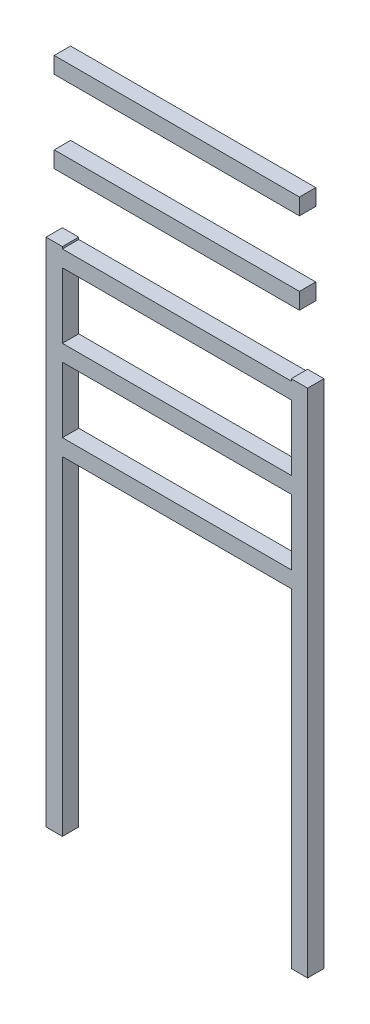
ISO-10303-21;
HEADER;
FILE_DESCRIPTION(('STEP AP214'),'2;1');
FILE_NAME('part.step','',(''),(''),'','','');
FILE_SCHEMA(('AUTOMOTIVE_DESIGN { 1 0 10303 214 1 1 1 1 }'));
ENDSEC;
DATA;
#1=APPLICATION_CONTEXT('core data for automotive mechanical design processes');
#2=APPLICATION_PROTOCOL_DEFINITION('international standard','automotive_design',2000,#1);
#3=PRODUCT_CONTEXT('',#1,'mechanical');
#4=PRODUCT('Part','Part','',(#3));
#5=PRODUCT_RELATED_PRODUCT_CATEGORY('part','',(#4));
#6=PRODUCT_DEFINITION_FORMATION('','',#4);
#7=PRODUCT_DEFINITION_CONTEXT('part definition',#1,'design');
#8=PRODUCT_DEFINITION('design','',#6,#7);
#9=PRODUCT_DEFINITION_SHAPE('','',#8);
#10=(LENGTH_UNIT() NAMED_UNIT(*) SI_UNIT(.MILLI.,.METRE.));
#11=(NAMED_UNIT(*) PLANE_ANGLE_UNIT() SI_UNIT($,.RADIAN.));
#12=(NAMED_UNIT(*) SI_UNIT($,.STERADIAN.) SOLID_ANGLE_UNIT());
#13=UNCERTAINTY_MEASURE_WITH_UNIT(LENGTH_MEASURE(1.E-05),#10,'distance_accuracy_value','');
#14=(GEOMETRIC_REPRESENTATION_CONTEXT(3) GLOBAL_UNCERTAINTY_ASSIGNED_CONTEXT((#13)) GLOBAL_UNIT_ASSIGNED_CONTEXT((#10,
#11,#12)) REPRESENTATION_CONTEXT('',''));
#15=CARTESIAN_POINT('',(0.,0.,0.));
#16=DIRECTION('',(0.,0.,1.));
#17=DIRECTION('',(1.,0.,0.));
#18=AXIS2_PLACEMENT_3D('',#15,#16,#17);
#19=CARTESIAN_POINT('',(600.,1960.,80.));
#20=DIRECTION('',(-1.,0.,0.));
#21=DIRECTION('',(0.,0.,1.));
#22=AXIS2_PLACEMENT_3D('',#19,#20,#21);
#23=PLANE('',#22);
#24=DIRECTION('',(0.,1.,0.));
#25=VECTOR('',#24,1.);
#26=CARTESIAN_POINT('',(600.,1960.,0.));
#27=LINE('',#26,#25);
#28=CARTESIAN_POINT('',(600.,1960.,0.));
#29=VERTEX_POINT('',#28);
#30=CARTESIAN_POINT('',(600.,2040.,0.));
#31=VERTEX_POINT('',#30);
#32=EDGE_CURVE('E115',#29,#31,#27,.T.);
#33=ORIENTED_EDGE('',*,*,#32,.T.);
#34=DIRECTION('',(0.,0.,-1.));
#35=VECTOR('',#34,1.);
#36=CARTESIAN_POINT('',(600.,2040.,80.));
#37=LINE('',#36,#35);
#38=CARTESIAN_POINT('',(600.,2040.,80.));
#39=VERTEX_POINT('',#38);
#40=EDGE_CURVE('E12',#39,#31,#37,.T.);
#41=ORIENTED_EDGE('',*,*,#40,.F.);
#42=DIRECTION('',(0.,1.,0.));
#43=VECTOR('',#42,1.);
#44=CARTESIAN_POINT('',(600.,1960.,80.));
#45=LINE('',#44,#43);
#46=CARTESIAN_POINT('',(600.,1960.,80.));
#47=VERTEX_POINT('',#46);
#48=EDGE_CURVE('E103',#47,#39,#45,.T.);
#49=ORIENTED_EDGE('',*,*,#48,.F.);
#50=DIRECTION('',(0.,0.,-1.));
#51=VECTOR('',#50,1.);
#52=CARTESIAN_POINT('',(600.,1960.,80.));
#53=LINE('',#52,#51);
#54=EDGE_CURVE('E111',#47,#29,#53,.T.);
#55=ORIENTED_EDGE('',*,*,#54,.T.);
#56=EDGE_LOOP('',(#33,#41,#49,#55));
#57=FACE_BOUND('',#56,.T.);
#58=ADVANCED_FACE('F52',(#57),#23,.F.);
#59=CARTESIAN_POINT('',(-600.,2040.,80.));
#60=DIRECTION('',(0.,-1.,0.));
#61=DIRECTION('',(0.,0.,-1.));
#62=AXIS2_PLACEMENT_3D('',#59,#60,#61);
#63=PLANE('',#62);
#64=DIRECTION('',(-1.,0.,0.));
#65=VECTOR('',#64,1.);
#66=CARTESIAN_POINT('',(-600.,2040.,0.));
#67=LINE('',#66,#65);
#68=CARTESIAN_POINT('',(-600.,2040.,0.));
#69=VERTEX_POINT('',#68);
#70=EDGE_CURVE('E107',#31,#69,#67,.T.);
#71=ORIENTED_EDGE('',*,*,#70,.T.);
#72=DIRECTION('',(0.,0.,-1.));
#73=VECTOR('',#72,1.);
#74=CARTESIAN_POINT('',(-600.,2040.,80.));
#75=LINE('',#74,#73);
#76=CARTESIAN_POINT('',(-600.,2040.,80.));
#77=VERTEX_POINT('',#76);
#78=EDGE_CURVE('E60',#77,#69,#75,.T.);
#79=ORIENTED_EDGE('',*,*,#78,.F.);
#80=DIRECTION('',(-1.,0.,0.));
#81=VECTOR('',#80,1.);
#82=CARTESIAN_POINT('',(-600.,2040.,80.));
#83=LINE('',#82,#81);
#84=EDGE_CURVE('E98',#39,#77,#83,.T.);
#85=ORIENTED_EDGE('',*,*,#84,.F.);
#86=ORIENTED_EDGE('',*,*,#40,.T.);
#87=EDGE_LOOP('',(#71,#79,#85,#86));
#88=FACE_BOUND('',#87,.T.);
#89=ADVANCED_FACE('F106',(#88),#63,.F.);
#90=CARTESIAN_POINT('',(-600.,1960.,80.));
#91=DIRECTION('',(1.,0.,0.));
#92=DIRECTION('',(0.,0.,-1.));
#93=AXIS2_PLACEMENT_3D('',#90,#91,#92);
#94=PLANE('',#93);
#95=DIRECTION('',(0.,-1.,0.));
#96=VECTOR('',#95,1.);
#97=CARTESIAN_POINT('',(-600.,1960.,0.));
#98=LINE('',#97,#96);
#99=CARTESIAN_POINT('',(-600.,1960.,0.));
#100=VERTEX_POINT('',#99);
#101=EDGE_CURVE('E85',#69,#100,#98,.T.);
#102=ORIENTED_EDGE('',*,*,#101,.T.);
#103=DIRECTION('',(0.,0.,-1.));
#104=VECTOR('',#103,1.);
#105=CARTESIAN_POINT('',(-600.,1960.,80.));
#106=LINE('',#105,#104);
#107=CARTESIAN_POINT('',(-600.,1960.,80.));
#108=VERTEX_POINT('',#107);
#109=EDGE_CURVE('E108',#108,#100,#106,.T.);
#110=ORIENTED_EDGE('',*,*,#109,.F.);
#111=DIRECTION('',(0.,-1.,0.));
#112=VECTOR('',#111,1.);
#113=CARTESIAN_POINT('',(-600.,1960.,80.));
#114=LINE('',#113,#112);
#115=EDGE_CURVE('E101',#77,#108,#114,.T.);
#116=ORIENTED_EDGE('',*,*,#115,.F.);
#117=ORIENTED_EDGE('',*,*,#78,.T.);
#118=EDGE_LOOP('',(#102,#110,#116,#117));
#119=FACE_BOUND('',#118,.T.);
#120=ADVANCED_FACE('F109',(#119),#94,.F.);
#121=CARTESIAN_POINT('',(-600.,1960.,80.));
#122=DIRECTION('',(0.,1.,0.));
#123=DIRECTION('',(0.,0.,1.));
#124=AXIS2_PLACEMENT_3D('',#121,#122,#123);
#125=PLANE('',#124);
#126=DIRECTION('',(1.,0.,0.));
#127=VECTOR('',#126,1.);
#128=CARTESIAN_POINT('',(-600.,1960.,0.));
#129=LINE('',#128,#127);
#130=EDGE_CURVE('E91',#100,#29,#129,.T.);
#131=ORIENTED_EDGE('',*,*,#130,.T.);
#132=ORIENTED_EDGE('',*,*,#54,.F.);
#133=DIRECTION('',(1.,0.,0.));
#134=VECTOR('',#133,1.);
#135=CARTESIAN_POINT('',(-600.,1960.,80.));
#136=LINE('',#135,#134);
#137=EDGE_CURVE('E68',#108,#47,#136,.T.);
#138=ORIENTED_EDGE('',*,*,#137,.F.);
#139=ORIENTED_EDGE('',*,*,#109,.T.);
#140=EDGE_LOOP('',(#131,#132,#138,#139));
#141=FACE_BOUND('',#140,.T.);
#142=ADVANCED_FACE('F122',(#141),#125,.F.);
#143=CARTESIAN_POINT('',(0.,0.,80.));
#144=DIRECTION('',(0.,0.,-1.));
#145=DIRECTION('',(-1.,0.,0.));
#146=AXIS2_PLACEMENT_3D('',#143,#144,#145);
#147=PLANE('',#146);
#148=ORIENTED_EDGE('',*,*,#48,.T.);
#149=ORIENTED_EDGE('',*,*,#84,.T.);
#150=ORIENTED_EDGE('',*,*,#115,.T.);
#151=ORIENTED_EDGE('',*,*,#137,.T.);
#152=EDGE_LOOP('',(#148,#149,#150,#151));
#153=FACE_BOUND('',#152,.T.);
#154=ADVANCED_FACE('F99',(#153),#147,.F.);
#155=CARTESIAN_POINT('',(0.,0.,0.));
#156=DIRECTION('',(0.,0.,-1.));
#157=DIRECTION('',(-1.,0.,0.));
#158=AXIS2_PLACEMENT_3D('',#155,#156,#157);
#159=PLANE('',#158);
#160=ORIENTED_EDGE('',*,*,#32,.F.);
#161=ORIENTED_EDGE('',*,*,#130,.F.);
#162=ORIENTED_EDGE('',*,*,#101,.F.);
#163=ORIENTED_EDGE('',*,*,#70,.F.);
#164=EDGE_LOOP('',(#160,#161,#162,#163));
#165=FACE_BOUND('',#164,.T.);
#166=ADVANCED_FACE('F125',(#165),#159,.T.);
#167=CLOSED_SHELL('',(#58,#89,#120,#142,#154,#166));
#168=MANIFOLD_SOLID_BREP('B2',#167);
#169=CARTESIAN_POINT('',(600.,1560.,80.));
#170=DIRECTION('',(-1.,0.,0.));
#171=DIRECTION('',(0.,0.,1.));
#172=AXIS2_PLACEMENT_3D('',#169,#170,#171);
#173=PLANE('',#172);
#174=DIRECTION('',(0.,1.,0.));
#175=VECTOR('',#174,1.);
#176=CARTESIAN_POINT('',(600.,1560.,0.));
#177=LINE('',#176,#175);
#178=CARTESIAN_POINT('',(600.,1560.,0.));
#179=VERTEX_POINT('',#178);
#180=CARTESIAN_POINT('',(600.,1640.,0.));
#181=VERTEX_POINT('',#180);
#182=EDGE_CURVE('E248',#179,#181,#177,.T.);
#183=ORIENTED_EDGE('',*,*,#182,.T.);
#184=DIRECTION('',(0.,0.,-1.));
#185=VECTOR('',#184,1.);
#186=CARTESIAN_POINT('',(600.,1640.,80.));
#187=LINE('',#186,#185);
#188=CARTESIAN_POINT('',(600.,1640.,80.));
#189=VERTEX_POINT('',#188);
#190=EDGE_CURVE('E50',#189,#181,#187,.T.);
#191=ORIENTED_EDGE('',*,*,#190,.F.);
#192=DIRECTION('',(0.,1.,0.));
#193=VECTOR('',#192,1.);
#194=CARTESIAN_POINT('',(600.,1560.,80.));
#195=LINE('',#194,#193);
#196=CARTESIAN_POINT('',(600.,1560.,80.));
#197=VERTEX_POINT('',#196);
#198=EDGE_CURVE('E236',#197,#189,#195,.T.);
#199=ORIENTED_EDGE('',*,*,#198,.F.);
#200=DIRECTION('',(0.,0.,-1.));
#201=VECTOR('',#200,1.);
#202=CARTESIAN_POINT('',(600.,1560.,80.));
#203=LINE('',#202,#201);
#204=EDGE_CURVE('E244',#197,#179,#203,.T.);
#205=ORIENTED_EDGE('',*,*,#204,.T.);
#206=EDGE_LOOP('',(#183,#191,#199,#205));
#207=FACE_BOUND('',#206,.T.);
#208=ADVANCED_FACE('F185',(#207),#173,.F.);
#209=CARTESIAN_POINT('',(-600.,1640.,80.));
#210=DIRECTION('',(0.,-1.,0.));
#211=DIRECTION('',(0.,0.,-1.));
#212=AXIS2_PLACEMENT_3D('',#209,#210,#211);
#213=PLANE('',#212);
#214=DIRECTION('',(-1.,0.,0.));
#215=VECTOR('',#214,1.);
#216=CARTESIAN_POINT('',(-600.,1640.,0.));
#217=LINE('',#216,#215);
#218=CARTESIAN_POINT('',(-600.,1640.,0.));
#219=VERTEX_POINT('',#218);
#220=EDGE_CURVE('E240',#181,#219,#217,.T.);
#221=ORIENTED_EDGE('',*,*,#220,.T.);
#222=DIRECTION('',(0.,0.,-1.));
#223=VECTOR('',#222,1.);
#224=CARTESIAN_POINT('',(-600.,1640.,80.));
#225=LINE('',#224,#223);
#226=CARTESIAN_POINT('',(-600.,1640.,80.));
#227=VERTEX_POINT('',#226);
#228=EDGE_CURVE('E193',#227,#219,#225,.T.);
#229=ORIENTED_EDGE('',*,*,#228,.F.);
#230=DIRECTION('',(-1.,0.,0.));
#231=VECTOR('',#230,1.);
#232=CARTESIAN_POINT('',(-600.,1640.,80.));
#233=LINE('',#232,#231);
#234=EDGE_CURVE('E231',#189,#227,#233,.T.);
#235=ORIENTED_EDGE('',*,*,#234,.F.);
#236=ORIENTED_EDGE('',*,*,#190,.T.);
#237=EDGE_LOOP('',(#221,#229,#235,#236));
#238=FACE_BOUND('',#237,.T.);
#239=ADVANCED_FACE('F239',(#238),#213,.F.);
#240=CARTESIAN_POINT('',(-600.,1560.,80.));
#241=DIRECTION('',(1.,0.,0.));
#242=DIRECTION('',(0.,0.,-1.));
#243=AXIS2_PLACEMENT_3D('',#240,#241,#242);
#244=PLANE('',#243);
#245=DIRECTION('',(0.,-1.,0.));
#246=VECTOR('',#245,1.);
#247=CARTESIAN_POINT('',(-600.,1560.,0.));
#248=LINE('',#247,#246);
#249=CARTESIAN_POINT('',(-600.,1560.,0.));
#250=VERTEX_POINT('',#249);
#251=EDGE_CURVE('E218',#219,#250,#248,.T.);
#252=ORIENTED_EDGE('',*,*,#251,.T.);
#253=DIRECTION('',(0.,0.,-1.));
#254=VECTOR('',#253,1.);
#255=CARTESIAN_POINT('',(-600.,1560.,80.));
#256=LINE('',#255,#254);
#257=CARTESIAN_POINT('',(-600.,1560.,80.));
#258=VERTEX_POINT('',#257);
#259=EDGE_CURVE('E241',#258,#250,#256,.T.);
#260=ORIENTED_EDGE('',*,*,#259,.F.);
#261=DIRECTION('',(0.,-1.,0.));
#262=VECTOR('',#261,1.);
#263=CARTESIAN_POINT('',(-600.,1560.,80.));
#264=LINE('',#263,#262);
#265=EDGE_CURVE('E234',#227,#258,#264,.T.);
#266=ORIENTED_EDGE('',*,*,#265,.F.);
#267=ORIENTED_EDGE('',*,*,#228,.T.);
#268=EDGE_LOOP('',(#252,#260,#266,#267));
#269=FACE_BOUND('',#268,.T.);
#270=ADVANCED_FACE('F242',(#269),#244,.F.);
#271=CARTESIAN_POINT('',(-600.,1560.,80.));
#272=DIRECTION('',(0.,1.,0.));
#273=DIRECTION('',(0.,0.,1.));
#274=AXIS2_PLACEMENT_3D('',#271,#272,#273);
#275=PLANE('',#274);
#276=DIRECTION('',(1.,0.,0.));
#277=VECTOR('',#276,1.);
#278=CARTESIAN_POINT('',(-600.,1560.,0.));
#279=LINE('',#278,#277);
#280=EDGE_CURVE('E224',#250,#179,#279,.T.);
#281=ORIENTED_EDGE('',*,*,#280,.T.);
#282=ORIENTED_EDGE('',*,*,#204,.F.);
#283=DIRECTION('',(1.,0.,0.));
#284=VECTOR('',#283,1.);
#285=CARTESIAN_POINT('',(-600.,1560.,80.));
#286=LINE('',#285,#284);
#287=EDGE_CURVE('E201',#258,#197,#286,.T.);
#288=ORIENTED_EDGE('',*,*,#287,.F.);
#289=ORIENTED_EDGE('',*,*,#259,.T.);
#290=EDGE_LOOP('',(#281,#282,#288,#289));
#291=FACE_BOUND('',#290,.T.);
#292=ADVANCED_FACE('F255',(#291),#275,.F.);
#293=CARTESIAN_POINT('',(0.,0.,80.));
#294=DIRECTION('',(0.,0.,-1.));
#295=DIRECTION('',(-1.,0.,0.));
#296=AXIS2_PLACEMENT_3D('',#293,#294,#295);
#297=PLANE('',#296);
#298=ORIENTED_EDGE('',*,*,#198,.T.);
#299=ORIENTED_EDGE('',*,*,#234,.T.);
#300=ORIENTED_EDGE('',*,*,#265,.T.);
#301=ORIENTED_EDGE('',*,*,#287,.T.);
#302=EDGE_LOOP('',(#298,#299,#300,#301));
#303=FACE_BOUND('',#302,.T.);
#304=ADVANCED_FACE('F232',(#303),#297,.F.);
#305=CARTESIAN_POINT('',(0.,0.,0.));
#306=DIRECTION('',(0.,0.,-1.));
#307=DIRECTION('',(-1.,0.,0.));
#308=AXIS2_PLACEMENT_3D('',#305,#306,#307);
#309=PLANE('',#308);
#310=ORIENTED_EDGE('',*,*,#182,.F.);
#311=ORIENTED_EDGE('',*,*,#280,.F.);
#312=ORIENTED_EDGE('',*,*,#251,.F.);
#313=ORIENTED_EDGE('',*,*,#220,.F.);
#314=EDGE_LOOP('',(#310,#311,#312,#313));
#315=FACE_BOUND('',#314,.T.);
#316=ADVANCED_FACE('F258',(#315),#309,.T.);
#317=CLOSED_SHELL('',(#208,#239,#270,#292,#304,#316));
#318=MANIFOLD_SOLID_BREP('B6',#317);
#319=CARTESIAN_POINT('',(-560.,-1250.,80.));
#320=DIRECTION('',(-1.,0.,0.));
#321=DIRECTION('',(0.,0.,1.));
#322=AXIS2_PLACEMENT_3D('',#319,#320,#321);
#323=PLANE('',#322);
#324=DIRECTION('',(0.,0.,1.));
#325=VECTOR('',#324,1.);
#326=CARTESIAN_POINT('',(-560.,1240.,80.));
#327=LINE('',#326,#325);
#328=CARTESIAN_POINT('',(-560.,1240.,0.));
#329=VERTEX_POINT('',#328);
#330=CARTESIAN_POINT('',(-560.,1240.,80.));
#331=VERTEX_POINT('',#330);
#332=EDGE_CURVE('E482',#329,#331,#327,.T.);
#333=ORIENTED_EDGE('',*,*,#332,.F.);
#334=DIRECTION('',(0.,1.,0.));
#335=VECTOR('',#334,1.);
#336=CARTESIAN_POINT('',(-560.,-1250.,0.));
#337=LINE('',#336,#335);
#338=CARTESIAN_POINT('',(-560.,1250.,0.));
#339=VERTEX_POINT('',#338);
#340=EDGE_CURVE('E549',#329,#339,#337,.T.);
#341=ORIENTED_EDGE('',*,*,#340,.T.);
#342=DIRECTION('',(0.,0.,-1.));
#343=VECTOR('',#342,1.);
#344=CARTESIAN_POINT('',(-560.,1250.,80.));
#345=LINE('',#344,#343);
#346=CARTESIAN_POINT('',(-560.,1250.,80.));
#347=VERTEX_POINT('',#346);
#348=EDGE_CURVE('E578',#347,#339,#345,.T.);
#349=ORIENTED_EDGE('',*,*,#348,.F.);
#350=DIRECTION('',(0.,1.,0.));
#351=VECTOR('',#350,1.);
#352=CARTESIAN_POINT('',(-560.,-1250.,80.));
#353=LINE('',#352,#351);
#354=EDGE_CURVE('E323',#331,#347,#353,.T.);
#355=ORIENTED_EDGE('',*,*,#354,.F.);
#356=EDGE_LOOP('',(#333,#341,#349,#355));
#357=FACE_BOUND('',#356,.T.);
#358=ADVANCED_FACE('F309',(#357),#323,.F.);
#359=DIRECTION('',(0.,0.,-1.));
#360=VECTOR('',#359,1.);
#361=CARTESIAN_POINT('',(-560.,1160.,80.));
#362=LINE('',#361,#360);
#363=CARTESIAN_POINT('',(-560.,1160.,80.));
#364=VERTEX_POINT('',#363);
#365=CARTESIAN_POINT('',(-560.,1160.,0.));
#366=VERTEX_POINT('',#365);
#367=EDGE_CURVE('E331',#364,#366,#362,.T.);
#368=ORIENTED_EDGE('',*,*,#367,.F.);
#369=CARTESIAN_POINT('',(-560.,840.,80.));
#370=VERTEX_POINT('',#369);
#371=EDGE_CURVE('E598',#370,#364,#353,.T.);
#372=ORIENTED_EDGE('',*,*,#371,.F.);
#373=DIRECTION('',(0.,0.,1.));
#374=VECTOR('',#373,1.);
#375=CARTESIAN_POINT('',(-560.,840.,80.));
#376=LINE('',#375,#374);
#377=CARTESIAN_POINT('',(-560.,840.,0.));
#378=VERTEX_POINT('',#377);
#379=EDGE_CURVE('E497',#378,#370,#376,.T.);
#380=ORIENTED_EDGE('',*,*,#379,.F.);
#381=EDGE_CURVE('E610',#378,#366,#337,.T.);
#382=ORIENTED_EDGE('',*,*,#381,.T.);
#383=EDGE_LOOP('',(#368,#372,#380,#382));
#384=FACE_BOUND('',#383,.T.);
#385=ADVANCED_FACE('F641',(#384),#323,.F.);
#386=CARTESIAN_POINT('',(560.,-1250.,80.));
#387=DIRECTION('',(1.,0.,0.));
#388=DIRECTION('',(0.,0.,-1.));
#389=AXIS2_PLACEMENT_3D('',#386,#387,#388);
#390=PLANE('',#389);
#391=DIRECTION('',(0.,0.,-1.));
#392=VECTOR('',#391,1.);
#393=CARTESIAN_POINT('',(560.,1240.,80.));
#394=LINE('',#393,#392);
#395=CARTESIAN_POINT('',(560.,1240.,80.));
#396=VERTEX_POINT('',#395);
#397=CARTESIAN_POINT('',(560.,1240.,0.));
#398=VERTEX_POINT('',#397);
#399=EDGE_CURVE('E479',#396,#398,#394,.T.);
#400=ORIENTED_EDGE('',*,*,#399,.F.);
#401=DIRECTION('',(0.,-1.,0.));
#402=VECTOR('',#401,1.);
#403=CARTESIAN_POINT('',(560.,-1250.,80.));
#404=LINE('',#403,#402);
#405=CARTESIAN_POINT('',(560.,1250.,80.));
#406=VERTEX_POINT('',#405);
#407=EDGE_CURVE('E508',#406,#396,#404,.T.);
#408=ORIENTED_EDGE('',*,*,#407,.F.);
#409=DIRECTION('',(0.,0.,-1.));
#410=VECTOR('',#409,1.);
#411=CARTESIAN_POINT('',(560.,1250.,80.));
#412=LINE('',#411,#410);
#413=CARTESIAN_POINT('',(560.,1250.,0.));
#414=VERTEX_POINT('',#413);
#415=EDGE_CURVE('E525',#406,#414,#412,.T.);
#416=ORIENTED_EDGE('',*,*,#415,.T.);
#417=DIRECTION('',(0.,-1.,0.));
#418=VECTOR('',#417,1.);
#419=CARTESIAN_POINT('',(560.,-1250.,0.));
#420=LINE('',#419,#418);
#421=EDGE_CURVE('E456',#414,#398,#420,.T.);
#422=ORIENTED_EDGE('',*,*,#421,.T.);
#423=EDGE_LOOP('',(#400,#408,#416,#422));
#424=FACE_BOUND('',#423,.T.);
#425=ADVANCED_FACE('F649',(#424),#390,.F.);
#426=DIRECTION('',(0.,0.,1.));
#427=VECTOR('',#426,1.);
#428=CARTESIAN_POINT('',(560.,1160.,80.));
#429=LINE('',#428,#427);
#430=CARTESIAN_POINT('',(560.,1160.,0.));
#431=VERTEX_POINT('',#430);
#432=CARTESIAN_POINT('',(560.,1160.,80.));
#433=VERTEX_POINT('',#432);
#434=EDGE_CURVE('E460',#431,#433,#429,.T.);
#435=ORIENTED_EDGE('',*,*,#434,.F.);
#436=CARTESIAN_POINT('',(560.,840.,0.));
#437=VERTEX_POINT('',#436);
#438=EDGE_CURVE('E446',#431,#437,#420,.T.);
#439=ORIENTED_EDGE('',*,*,#438,.T.);
#440=DIRECTION('',(0.,0.,-1.));
#441=VECTOR('',#440,1.);
#442=CARTESIAN_POINT('',(560.,840.,80.));
#443=LINE('',#442,#441);
#444=CARTESIAN_POINT('',(560.,840.,80.));
#445=VERTEX_POINT('',#444);
#446=EDGE_CURVE('E183',#445,#437,#443,.T.);
#447=ORIENTED_EDGE('',*,*,#446,.F.);
#448=EDGE_CURVE('E462',#433,#445,#404,.T.);
#449=ORIENTED_EDGE('',*,*,#448,.F.);
#450=EDGE_LOOP('',(#435,#439,#447,#449));
#451=FACE_BOUND('',#450,.T.);
#452=ADVANCED_FACE('F461',(#451),#390,.F.);
#453=DIRECTION('',(0.,0.,-1.));
#454=VECTOR('',#453,1.);
#455=CARTESIAN_POINT('',(-560.,760.,80.));
#456=LINE('',#455,#454);
#457=CARTESIAN_POINT('',(-560.,760.,80.));
#458=VERTEX_POINT('',#457);
#459=CARTESIAN_POINT('',(-560.,760.,0.));
#460=VERTEX_POINT('',#459);
#461=EDGE_CURVE('E491',#458,#460,#456,.T.);
#462=ORIENTED_EDGE('',*,*,#461,.F.);
#463=CARTESIAN_POINT('',(-560.,440.,80.));
#464=VERTEX_POINT('',#463);
#465=EDGE_CURVE('E554',#464,#458,#353,.T.);
#466=ORIENTED_EDGE('',*,*,#465,.F.);
#467=DIRECTION('',(0.,0.,1.));
#468=VECTOR('',#467,1.);
#469=CARTESIAN_POINT('',(-560.,440.,80.));
#470=LINE('',#469,#468);
#471=CARTESIAN_POINT('',(-560.,440.,0.));
#472=VERTEX_POINT('',#471);
#473=EDGE_CURVE('E546',#472,#464,#470,.T.);
#474=ORIENTED_EDGE('',*,*,#473,.F.);
#475=EDGE_CURVE('E564',#472,#460,#337,.T.);
#476=ORIENTED_EDGE('',*,*,#475,.T.);
#477=EDGE_LOOP('',(#462,#466,#474,#476));
#478=FACE_BOUND('',#477,.T.);
#479=ADVANCED_FACE('F639',(#478),#323,.F.);
#480=DIRECTION('',(0.,0.,1.));
#481=VECTOR('',#480,1.);
#482=CARTESIAN_POINT('',(560.,760.,80.));
#483=LINE('',#482,#481);
#484=CARTESIAN_POINT('',(560.,760.,0.));
#485=VERTEX_POINT('',#484);
#486=CARTESIAN_POINT('',(560.,760.,80.));
#487=VERTEX_POINT('',#486);
#488=EDGE_CURVE('E316',#485,#487,#483,.T.);
#489=ORIENTED_EDGE('',*,*,#488,.F.);
#490=CARTESIAN_POINT('',(560.,440.,0.));
#491=VERTEX_POINT('',#490);
#492=EDGE_CURVE('E457',#485,#491,#420,.T.);
#493=ORIENTED_EDGE('',*,*,#492,.T.);
#494=DIRECTION('',(0.,0.,1.));
#495=VECTOR('',#494,1.);
#496=CARTESIAN_POINT('',(560.,440.,80.));
#497=LINE('',#496,#495);
#498=CARTESIAN_POINT('',(560.,440.,80.));
#499=VERTEX_POINT('',#498);
#500=EDGE_CURVE('E531',#491,#499,#497,.T.);
#501=ORIENTED_EDGE('',*,*,#500,.T.);
#502=EDGE_CURVE('E593',#487,#499,#404,.T.);
#503=ORIENTED_EDGE('',*,*,#502,.F.);
#504=EDGE_LOOP('',(#489,#493,#501,#503));
#505=FACE_BOUND('',#504,.T.);
#506=ADVANCED_FACE('F634',(#505),#390,.F.);
#507=CARTESIAN_POINT('',(-600.,440.,80.));
#508=DIRECTION('',(0.,-1.,0.));
#509=DIRECTION('',(0.,0.,-1.));
#510=AXIS2_PLACEMENT_3D('',#507,#508,#509);
#511=PLANE('',#510);
#512=ORIENTED_EDGE('',*,*,#500,.F.);
#513=DIRECTION('',(-1.,0.,0.));
#514=VECTOR('',#513,1.);
#515=CARTESIAN_POINT('',(-600.,440.,0.));
#516=LINE('',#515,#514);
#517=EDGE_CURVE('E534',#491,#472,#516,.T.);
#518=ORIENTED_EDGE('',*,*,#517,.T.);
#519=ORIENTED_EDGE('',*,*,#473,.T.);
#520=DIRECTION('',(-1.,0.,0.));
#521=VECTOR('',#520,1.);
#522=CARTESIAN_POINT('',(-600.,440.,80.));
#523=LINE('',#522,#521);
#524=EDGE_CURVE('E535',#499,#464,#523,.T.);
#525=ORIENTED_EDGE('',*,*,#524,.F.);
#526=EDGE_LOOP('',(#512,#518,#519,#525));
#527=FACE_BOUND('',#526,.T.);
#528=ADVANCED_FACE('F637',(#527),#511,.F.);
#529=CARTESIAN_POINT('',(-600.,360.,80.));
#530=DIRECTION('',(0.,1.,0.));
#531=DIRECTION('',(0.,0.,1.));
#532=AXIS2_PLACEMENT_3D('',#529,#530,#531);
#533=PLANE('',#532);
#534=DIRECTION('',(0.,0.,-1.));
#535=VECTOR('',#534,1.);
#536=CARTESIAN_POINT('',(560.,360.,80.));
#537=LINE('',#536,#535);
#538=CARTESIAN_POINT('',(560.,360.,80.));
#539=VERTEX_POINT('',#538);
#540=CARTESIAN_POINT('',(560.,360.,0.));
#541=VERTEX_POINT('',#540);
#542=EDGE_CURVE('E581',#539,#541,#537,.T.);
#543=ORIENTED_EDGE('',*,*,#542,.F.);
#544=DIRECTION('',(1.,0.,0.));
#545=VECTOR('',#544,1.);
#546=CARTESIAN_POINT('',(-600.,360.,80.));
#547=LINE('',#546,#545);
#548=CARTESIAN_POINT('',(-560.,360.,80.));
#549=VERTEX_POINT('',#548);
#550=EDGE_CURVE('E537',#549,#539,#547,.T.);
#551=ORIENTED_EDGE('',*,*,#550,.F.);
#552=DIRECTION('',(0.,0.,-1.));
#553=VECTOR('',#552,1.);
#554=CARTESIAN_POINT('',(-560.,360.,80.));
#555=LINE('',#554,#553);
#556=CARTESIAN_POINT('',(-560.,360.,0.));
#557=VERTEX_POINT('',#556);
#558=EDGE_CURVE('E541',#549,#557,#555,.T.);
#559=ORIENTED_EDGE('',*,*,#558,.T.);
#560=DIRECTION('',(1.,0.,0.));
#561=VECTOR('',#560,1.);
#562=CARTESIAN_POINT('',(-600.,360.,0.));
#563=LINE('',#562,#561);
#564=EDGE_CURVE('E538',#557,#541,#563,.T.);
#565=ORIENTED_EDGE('',*,*,#564,.T.);
#566=EDGE_LOOP('',(#543,#551,#559,#565));
#567=FACE_BOUND('',#566,.T.);
#568=ADVANCED_FACE('F627',(#567),#533,.F.);
#569=ORIENTED_EDGE('',*,*,#558,.F.);
#570=CARTESIAN_POINT('',(-560.,-1250.,80.));
#571=VERTEX_POINT('',#570);
#572=EDGE_CURVE('E550',#571,#549,#353,.T.);
#573=ORIENTED_EDGE('',*,*,#572,.F.);
#574=DIRECTION('',(0.,0.,-1.));
#575=VECTOR('',#574,1.);
#576=CARTESIAN_POINT('',(-560.,-1250.,80.));
#577=LINE('',#576,#575);
#578=CARTESIAN_POINT('',(-560.,-1250.,0.));
#579=VERTEX_POINT('',#578);
#580=EDGE_CURVE('E560',#571,#579,#577,.T.);
#581=ORIENTED_EDGE('',*,*,#580,.T.);
#582=EDGE_CURVE('E561',#579,#557,#337,.T.);
#583=ORIENTED_EDGE('',*,*,#582,.T.);
#584=EDGE_LOOP('',(#569,#573,#581,#583));
#585=FACE_BOUND('',#584,.T.);
#586=ADVANCED_FACE('F624',(#585),#323,.F.);
#587=CARTESIAN_POINT('',(-640.,1250.,80.));
#588=DIRECTION('',(0.,-1.,0.));
#589=DIRECTION('',(0.,0.,-1.));
#590=AXIS2_PLACEMENT_3D('',#587,#588,#589);
#591=PLANE('',#590);
#592=DIRECTION('',(-1.,0.,0.));
#593=VECTOR('',#592,1.);
#594=CARTESIAN_POINT('',(-640.,1250.,0.));
#595=LINE('',#594,#593);
#596=CARTESIAN_POINT('',(-640.,1250.,0.));
#597=VERTEX_POINT('',#596);
#598=EDGE_CURVE('E563',#339,#597,#595,.T.);
#599=ORIENTED_EDGE('',*,*,#598,.T.);
#600=DIRECTION('',(0.,0.,-1.));
#601=VECTOR('',#600,1.);
#602=CARTESIAN_POINT('',(-640.,1250.,80.));
#603=LINE('',#602,#601);
#604=CARTESIAN_POINT('',(-640.,1250.,80.));
#605=VERTEX_POINT('',#604);
#606=EDGE_CURVE('E575',#605,#597,#603,.T.);
#607=ORIENTED_EDGE('',*,*,#606,.F.);
#608=DIRECTION('',(-1.,0.,0.));
#609=VECTOR('',#608,1.);
#610=CARTESIAN_POINT('',(-640.,1250.,80.));
#611=LINE('',#610,#609);
#612=EDGE_CURVE('E553',#347,#605,#611,.T.);
#613=ORIENTED_EDGE('',*,*,#612,.F.);
#614=ORIENTED_EDGE('',*,*,#348,.T.);
#615=EDGE_LOOP('',(#599,#607,#613,#614));
#616=FACE_BOUND('',#615,.T.);
#617=ADVANCED_FACE('F605',(#616),#591,.F.);
#618=CARTESIAN_POINT('',(-640.,-1250.,80.));
#619=DIRECTION('',(1.,0.,0.));
#620=DIRECTION('',(0.,0.,-1.));
#621=AXIS2_PLACEMENT_3D('',#618,#619,#620);
#622=PLANE('',#621);
#623=DIRECTION('',(0.,-1.,0.));
#624=VECTOR('',#623,1.);
#625=CARTESIAN_POINT('',(-640.,-1250.,0.));
#626=LINE('',#625,#624);
#627=CARTESIAN_POINT('',(-640.,-1250.,0.));
#628=VERTEX_POINT('',#627);
#629=EDGE_CURVE('E566',#597,#628,#626,.T.);
#630=ORIENTED_EDGE('',*,*,#629,.T.);
#631=DIRECTION('',(0.,0.,-1.));
#632=VECTOR('',#631,1.);
#633=CARTESIAN_POINT('',(-640.,-1250.,80.));
#634=LINE('',#633,#632);
#635=CARTESIAN_POINT('',(-640.,-1250.,80.));
#636=VERTEX_POINT('',#635);
#637=EDGE_CURVE('E572',#636,#628,#634,.T.);
#638=ORIENTED_EDGE('',*,*,#637,.F.);
#639=DIRECTION('',(0.,-1.,0.));
#640=VECTOR('',#639,1.);
#641=CARTESIAN_POINT('',(-640.,-1250.,80.));
#642=LINE('',#641,#640);
#643=EDGE_CURVE('E556',#605,#636,#642,.T.);
#644=ORIENTED_EDGE('',*,*,#643,.F.);
#645=ORIENTED_EDGE('',*,*,#606,.T.);
#646=EDGE_LOOP('',(#630,#638,#644,#645));
#647=FACE_BOUND('',#646,.T.);
#648=ADVANCED_FACE('F614',(#647),#622,.F.);
#649=CARTESIAN_POINT('',(-640.,-1250.,80.));
#650=DIRECTION('',(0.,1.,0.));
#651=DIRECTION('',(0.,0.,1.));
#652=AXIS2_PLACEMENT_3D('',#649,#650,#651);
#653=PLANE('',#652);
#654=DIRECTION('',(1.,0.,0.));
#655=VECTOR('',#654,1.);
#656=CARTESIAN_POINT('',(-640.,-1250.,0.));
#657=LINE('',#656,#655);
#658=EDGE_CURVE('E568',#628,#579,#657,.T.);
#659=ORIENTED_EDGE('',*,*,#658,.T.);
#660=ORIENTED_EDGE('',*,*,#580,.F.);
#661=DIRECTION('',(1.,0.,0.));
#662=VECTOR('',#661,1.);
#663=CARTESIAN_POINT('',(-640.,-1250.,80.));
#664=LINE('',#663,#662);
#665=EDGE_CURVE('E558',#636,#571,#664,.T.);
#666=ORIENTED_EDGE('',*,*,#665,.F.);
#667=ORIENTED_EDGE('',*,*,#637,.T.);
#668=EDGE_LOOP('',(#659,#660,#666,#667));
#669=FACE_BOUND('',#668,.T.);
#670=ADVANCED_FACE('F621',(#669),#653,.F.);
#671=CARTESIAN_POINT('',(0.,0.,80.));
#672=DIRECTION('',(0.,0.,-1.));
#673=DIRECTION('',(-1.,0.,0.));
#674=AXIS2_PLACEMENT_3D('',#671,#672,#673);
#675=PLANE('',#674);
#676=DIRECTION('',(-1.,0.,0.));
#677=VECTOR('',#676,1.);
#678=CARTESIAN_POINT('',(-600.,1240.,80.));
#679=LINE('',#678,#677);
#680=EDGE_CURVE('E469',#396,#331,#679,.T.);
#681=ORIENTED_EDGE('',*,*,#680,.T.);
#682=ORIENTED_EDGE('',*,*,#354,.T.);
#683=ORIENTED_EDGE('',*,*,#612,.T.);
#684=ORIENTED_EDGE('',*,*,#643,.T.);
#685=ORIENTED_EDGE('',*,*,#665,.T.);
#686=ORIENTED_EDGE('',*,*,#572,.T.);
#687=ORIENTED_EDGE('',*,*,#550,.T.);
#688=CARTESIAN_POINT('',(560.,-1250.,80.));
#689=VERTEX_POINT('',#688);
#690=EDGE_CURVE('E507',#539,#689,#404,.T.);
#691=ORIENTED_EDGE('',*,*,#690,.T.);
#692=DIRECTION('',(1.,0.,0.));
#693=VECTOR('',#692,1.);
#694=CARTESIAN_POINT('',(560.,-1250.,80.));
#695=LINE('',#694,#693);
#696=CARTESIAN_POINT('',(640.,-1250.,80.));
#697=VERTEX_POINT('',#696);
#698=EDGE_CURVE('E511',#689,#697,#695,.T.);
#699=ORIENTED_EDGE('',*,*,#698,.T.);
#700=DIRECTION('',(0.,1.,0.));
#701=VECTOR('',#700,1.);
#702=CARTESIAN_POINT('',(640.,-1250.,80.));
#703=LINE('',#702,#701);
#704=CARTESIAN_POINT('',(640.,1250.,80.));
#705=VERTEX_POINT('',#704);
#706=EDGE_CURVE('E501',#697,#705,#703,.T.);
#707=ORIENTED_EDGE('',*,*,#706,.T.);
#708=DIRECTION('',(-1.,0.,0.));
#709=VECTOR('',#708,1.);
#710=CARTESIAN_POINT('',(560.,1250.,80.));
#711=LINE('',#710,#709);
#712=EDGE_CURVE('E504',#705,#406,#711,.T.);
#713=ORIENTED_EDGE('',*,*,#712,.T.);
#714=ORIENTED_EDGE('',*,*,#407,.T.);
#715=EDGE_LOOP('',(#681,#682,#683,#684,#685,#686,#687,#691,#699,#707,#713,#714));
#716=FACE_BOUND('',#715,.T.);
#717=ORIENTED_EDGE('',*,*,#371,.T.);
#718=DIRECTION('',(1.,0.,0.));
#719=VECTOR('',#718,1.);
#720=CARTESIAN_POINT('',(-600.,1160.,80.));
#721=LINE('',#720,#719);
#722=EDGE_CURVE('E466',#364,#433,#721,.T.);
#723=ORIENTED_EDGE('',*,*,#722,.T.);
#724=ORIENTED_EDGE('',*,*,#448,.T.);
#725=DIRECTION('',(-1.,0.,0.));
#726=VECTOR('',#725,1.);
#727=CARTESIAN_POINT('',(-600.,840.,80.));
#728=LINE('',#727,#726);
#729=EDGE_CURVE('E484',#445,#370,#728,.T.);
#730=ORIENTED_EDGE('',*,*,#729,.T.);
#731=EDGE_LOOP('',(#717,#723,#724,#730));
#732=FACE_BOUND('',#731,.T.);
#733=ORIENTED_EDGE('',*,*,#465,.T.);
#734=DIRECTION('',(1.,0.,0.));
#735=VECTOR('',#734,1.);
#736=CARTESIAN_POINT('',(-600.,760.,80.));
#737=LINE('',#736,#735);
#738=EDGE_CURVE('E487',#458,#487,#737,.T.);
#739=ORIENTED_EDGE('',*,*,#738,.T.);
#740=ORIENTED_EDGE('',*,*,#502,.T.);
#741=ORIENTED_EDGE('',*,*,#524,.T.);
#742=EDGE_LOOP('',(#733,#739,#740,#741));
#743=FACE_BOUND('',#742,.T.);
#744=ADVANCED_FACE('F592',(#716,#732,#743),#675,.F.);
#745=CARTESIAN_POINT('',(0.,0.,0.));
#746=DIRECTION('',(0.,0.,-1.));
#747=DIRECTION('',(-1.,0.,0.));
#748=AXIS2_PLACEMENT_3D('',#745,#746,#747);
#749=PLANE('',#748);
#750=ORIENTED_EDGE('',*,*,#340,.F.);
#751=DIRECTION('',(-1.,0.,0.));
#752=VECTOR('',#751,1.);
#753=CARTESIAN_POINT('',(-600.,1240.,0.));
#754=LINE('',#753,#752);
#755=EDGE_CURVE('E470',#398,#329,#754,.T.);
#756=ORIENTED_EDGE('',*,*,#755,.F.);
#757=ORIENTED_EDGE('',*,*,#421,.F.);
#758=DIRECTION('',(-1.,0.,0.));
#759=VECTOR('',#758,1.);
#760=CARTESIAN_POINT('',(560.,1250.,0.));
#761=LINE('',#760,#759);
#762=CARTESIAN_POINT('',(640.,1250.,0.));
#763=VERTEX_POINT('',#762);
#764=EDGE_CURVE('E516',#763,#414,#761,.T.);
#765=ORIENTED_EDGE('',*,*,#764,.F.);
#766=DIRECTION('',(0.,1.,0.));
#767=VECTOR('',#766,1.);
#768=CARTESIAN_POINT('',(640.,-1250.,0.));
#769=LINE('',#768,#767);
#770=CARTESIAN_POINT('',(640.,-1250.,0.));
#771=VERTEX_POINT('',#770);
#772=EDGE_CURVE('E500',#771,#763,#769,.T.);
#773=ORIENTED_EDGE('',*,*,#772,.F.);
#774=DIRECTION('',(1.,0.,0.));
#775=VECTOR('',#774,1.);
#776=CARTESIAN_POINT('',(560.,-1250.,0.));
#777=LINE('',#776,#775);
#778=CARTESIAN_POINT('',(560.,-1250.,0.));
#779=VERTEX_POINT('',#778);
#780=EDGE_CURVE('E505',#779,#771,#777,.T.);
#781=ORIENTED_EDGE('',*,*,#780,.F.);
#782=EDGE_CURVE('E517',#541,#779,#420,.T.);
#783=ORIENTED_EDGE('',*,*,#782,.F.);
#784=ORIENTED_EDGE('',*,*,#564,.F.);
#785=ORIENTED_EDGE('',*,*,#582,.F.);
#786=ORIENTED_EDGE('',*,*,#658,.F.);
#787=ORIENTED_EDGE('',*,*,#629,.F.);
#788=ORIENTED_EDGE('',*,*,#598,.F.);
#789=EDGE_LOOP('',(#750,#756,#757,#765,#773,#781,#783,#784,#785,#786,#787,#788));
#790=FACE_BOUND('',#789,.T.);
#791=ORIENTED_EDGE('',*,*,#438,.F.);
#792=DIRECTION('',(1.,0.,0.));
#793=VECTOR('',#792,1.);
#794=CARTESIAN_POINT('',(-600.,1160.,0.));
#795=LINE('',#794,#793);
#796=EDGE_CURVE('E451',#366,#431,#795,.T.);
#797=ORIENTED_EDGE('',*,*,#796,.F.);
#798=ORIENTED_EDGE('',*,*,#381,.F.);
#799=DIRECTION('',(-1.,0.,0.));
#800=VECTOR('',#799,1.);
#801=CARTESIAN_POINT('',(-600.,840.,0.));
#802=LINE('',#801,#800);
#803=EDGE_CURVE('E453',#437,#378,#802,.T.);
#804=ORIENTED_EDGE('',*,*,#803,.F.);
#805=EDGE_LOOP('',(#791,#797,#798,#804));
#806=FACE_BOUND('',#805,.T.);
#807=DIRECTION('',(1.,0.,0.));
#808=VECTOR('',#807,1.);
#809=CARTESIAN_POINT('',(-600.,760.,0.));
#810=LINE('',#809,#808);
#811=EDGE_CURVE('E488',#460,#485,#810,.T.);
#812=ORIENTED_EDGE('',*,*,#811,.F.);
#813=ORIENTED_EDGE('',*,*,#475,.F.);
#814=ORIENTED_EDGE('',*,*,#517,.F.);
#815=ORIENTED_EDGE('',*,*,#492,.F.);
#816=EDGE_LOOP('',(#812,#813,#814,#815));
#817=FACE_BOUND('',#816,.T.);
#818=ADVANCED_FACE('F448',(#790,#806,#817),#749,.T.);
#819=ORIENTED_EDGE('',*,*,#690,.F.);
#820=ORIENTED_EDGE('',*,*,#542,.T.);
#821=ORIENTED_EDGE('',*,*,#782,.T.);
#822=DIRECTION('',(0.,0.,-1.));
#823=VECTOR('',#822,1.);
#824=CARTESIAN_POINT('',(560.,-1250.,80.));
#825=LINE('',#824,#823);
#826=EDGE_CURVE('E522',#689,#779,#825,.T.);
#827=ORIENTED_EDGE('',*,*,#826,.F.);
#828=EDGE_LOOP('',(#819,#820,#821,#827));
#829=FACE_BOUND('',#828,.T.);
#830=ADVANCED_FACE('F647',(#829),#390,.F.);
#831=CARTESIAN_POINT('',(640.,-1250.,80.));
#832=DIRECTION('',(-1.,0.,0.));
#833=DIRECTION('',(0.,0.,1.));
#834=AXIS2_PLACEMENT_3D('',#831,#832,#833);
#835=PLANE('',#834);
#836=ORIENTED_EDGE('',*,*,#772,.T.);
#837=DIRECTION('',(0.,0.,-1.));
#838=VECTOR('',#837,1.);
#839=CARTESIAN_POINT('',(640.,1250.,80.));
#840=LINE('',#839,#838);
#841=EDGE_CURVE('E528',#705,#763,#840,.T.);
#842=ORIENTED_EDGE('',*,*,#841,.F.);
#843=ORIENTED_EDGE('',*,*,#706,.F.);
#844=DIRECTION('',(0.,0.,-1.));
#845=VECTOR('',#844,1.);
#846=CARTESIAN_POINT('',(640.,-1250.,80.));
#847=LINE('',#846,#845);
#848=EDGE_CURVE('E513',#697,#771,#847,.T.);
#849=ORIENTED_EDGE('',*,*,#848,.T.);
#850=EDGE_LOOP('',(#836,#842,#843,#849));
#851=FACE_BOUND('',#850,.T.);
#852=ADVANCED_FACE('F720',(#851),#835,.F.);
#853=CARTESIAN_POINT('',(560.,1250.,80.));
#854=DIRECTION('',(0.,-1.,0.));
#855=DIRECTION('',(0.,0.,-1.));
#856=AXIS2_PLACEMENT_3D('',#853,#854,#855);
#857=PLANE('',#856);
#858=ORIENTED_EDGE('',*,*,#764,.T.);
#859=ORIENTED_EDGE('',*,*,#415,.F.);
#860=ORIENTED_EDGE('',*,*,#712,.F.);
#861=ORIENTED_EDGE('',*,*,#841,.T.);
#862=EDGE_LOOP('',(#858,#859,#860,#861));
#863=FACE_BOUND('',#862,.T.);
#864=ADVANCED_FACE('F715',(#863),#857,.F.);
#865=CARTESIAN_POINT('',(560.,-1250.,80.));
#866=DIRECTION('',(0.,1.,0.));
#867=DIRECTION('',(0.,0.,1.));
#868=AXIS2_PLACEMENT_3D('',#865,#866,#867);
#869=PLANE('',#868);
#870=ORIENTED_EDGE('',*,*,#780,.T.);
#871=ORIENTED_EDGE('',*,*,#848,.F.);
#872=ORIENTED_EDGE('',*,*,#698,.F.);
#873=ORIENTED_EDGE('',*,*,#826,.T.);
#874=EDGE_LOOP('',(#870,#871,#872,#873));
#875=FACE_BOUND('',#874,.T.);
#876=ADVANCED_FACE('F713',(#875),#869,.F.);
#877=CARTESIAN_POINT('',(-600.,840.,80.));
#878=DIRECTION('',(0.,-1.,0.));
#879=DIRECTION('',(0.,0.,-1.));
#880=AXIS2_PLACEMENT_3D('',#877,#878,#879);
#881=PLANE('',#880);
#882=ORIENTED_EDGE('',*,*,#803,.T.);
#883=ORIENTED_EDGE('',*,*,#379,.T.);
#884=ORIENTED_EDGE('',*,*,#729,.F.);
#885=ORIENTED_EDGE('',*,*,#446,.T.);
#886=EDGE_LOOP('',(#882,#883,#884,#885));
#887=FACE_BOUND('',#886,.T.);
#888=ADVANCED_FACE('F711',(#887),#881,.F.);
#889=CARTESIAN_POINT('',(-600.,760.,80.));
#890=DIRECTION('',(0.,1.,0.));
#891=DIRECTION('',(0.,0.,1.));
#892=AXIS2_PLACEMENT_3D('',#889,#890,#891);
#893=PLANE('',#892);
#894=ORIENTED_EDGE('',*,*,#738,.F.);
#895=ORIENTED_EDGE('',*,*,#461,.T.);
#896=ORIENTED_EDGE('',*,*,#811,.T.);
#897=ORIENTED_EDGE('',*,*,#488,.T.);
#898=EDGE_LOOP('',(#894,#895,#896,#897));
#899=FACE_BOUND('',#898,.T.);
#900=ADVANCED_FACE('F587',(#899),#893,.F.);
#901=CARTESIAN_POINT('',(-600.,1240.,80.));
#902=DIRECTION('',(0.,-1.,0.));
#903=DIRECTION('',(0.,0.,-1.));
#904=AXIS2_PLACEMENT_3D('',#901,#902,#903);
#905=PLANE('',#904);
#906=ORIENTED_EDGE('',*,*,#755,.T.);
#907=ORIENTED_EDGE('',*,*,#332,.T.);
#908=ORIENTED_EDGE('',*,*,#680,.F.);
#909=ORIENTED_EDGE('',*,*,#399,.T.);
#910=EDGE_LOOP('',(#906,#907,#908,#909));
#911=FACE_BOUND('',#910,.T.);
#912=ADVANCED_FACE('F694',(#911),#905,.F.);
#913=CARTESIAN_POINT('',(-600.,1160.,80.));
#914=DIRECTION('',(0.,1.,0.));
#915=DIRECTION('',(0.,0.,1.));
#916=AXIS2_PLACEMENT_3D('',#913,#914,#915);
#917=PLANE('',#916);
#918=ORIENTED_EDGE('',*,*,#722,.F.);
#919=ORIENTED_EDGE('',*,*,#367,.T.);
#920=ORIENTED_EDGE('',*,*,#796,.T.);
#921=ORIENTED_EDGE('',*,*,#434,.T.);
#922=EDGE_LOOP('',(#918,#919,#920,#921));
#923=FACE_BOUND('',#922,.T.);
#924=ADVANCED_FACE('F468',(#923),#917,.F.);
#925=CLOSED_SHELL('',(#358,#385,#425,#452,#479,#506,#528,#568,#586,#617,#648,#670,#744,#818,
#830,#852,#864,#876,#888,#900,#912,#924));
#926=MANIFOLD_SOLID_BREP('B44',#925);
#927=ADVANCED_BREP_SHAPE_REPRESENTATION('',(#18,#168,#318,#926),#14);
#928=SHAPE_DEFINITION_REPRESENTATION(#9,#927);
ENDSEC;
END-ISO-10303-21;
